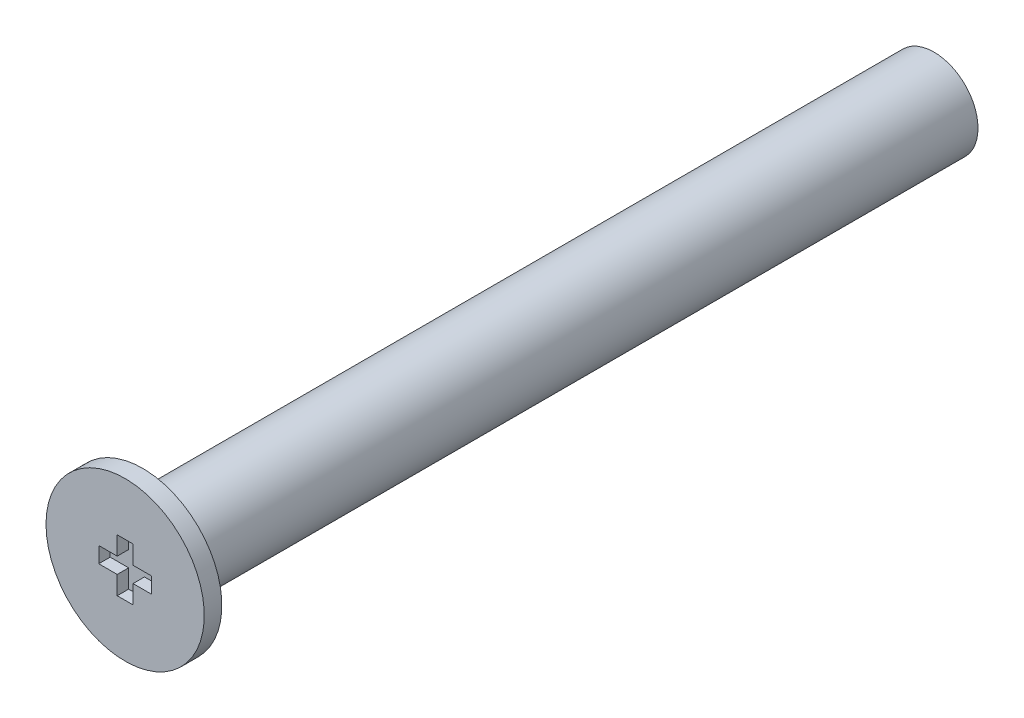
ISO-10303-21;
HEADER;
FILE_DESCRIPTION(('STEP AP214'),'2;1');
FILE_NAME('part.step','',(''),(''),'','','');
FILE_SCHEMA(('AUTOMOTIVE_DESIGN { 1 0 10303 214 1 1 1 1 }'));
ENDSEC;
DATA;
#1=APPLICATION_CONTEXT('core data for automotive mechanical design processes');
#2=APPLICATION_PROTOCOL_DEFINITION('international standard','automotive_design',2000,#1);
#3=PRODUCT_CONTEXT('',#1,'mechanical');
#4=PRODUCT('Part','Part','',(#3));
#5=PRODUCT_RELATED_PRODUCT_CATEGORY('part','',(#4));
#6=PRODUCT_DEFINITION_FORMATION('','',#4);
#7=PRODUCT_DEFINITION_CONTEXT('part definition',#1,'design');
#8=PRODUCT_DEFINITION('design','',#6,#7);
#9=PRODUCT_DEFINITION_SHAPE('','',#8);
#10=(LENGTH_UNIT() NAMED_UNIT(*) SI_UNIT(.MILLI.,.METRE.));
#11=(NAMED_UNIT(*) PLANE_ANGLE_UNIT() SI_UNIT($,.RADIAN.));
#12=(NAMED_UNIT(*) SI_UNIT($,.STERADIAN.) SOLID_ANGLE_UNIT());
#13=UNCERTAINTY_MEASURE_WITH_UNIT(LENGTH_MEASURE(1.E-05),#10,'distance_accuracy_value','');
#14=(GEOMETRIC_REPRESENTATION_CONTEXT(3) GLOBAL_UNCERTAINTY_ASSIGNED_CONTEXT((#13)) GLOBAL_UNIT_ASSIGNED_CONTEXT((#10,
#11,#12)) REPRESENTATION_CONTEXT('',''));
#15=CARTESIAN_POINT('',(0.,0.,0.));
#16=DIRECTION('',(0.,0.,1.));
#17=DIRECTION('',(1.,0.,0.));
#18=AXIS2_PLACEMENT_3D('',#15,#16,#17);
#19=CARTESIAN_POINT('',(0.,0.,-45.));
#20=DIRECTION('',(0.,0.,1.));
#21=DIRECTION('',(1.,0.,0.));
#22=AXIS2_PLACEMENT_3D('',#19,#20,#21);
#23=CYLINDRICAL_SURFACE('',#22,2.5);
#24=CARTESIAN_POINT('',(0.,0.,-45.));
#25=DIRECTION('',(0.,0.,1.));
#26=DIRECTION('',(1.,0.,0.));
#27=AXIS2_PLACEMENT_3D('',#24,#25,#26);
#28=CIRCLE('',#27,2.5);
#29=CARTESIAN_POINT('',(2.5,0.,-45.));
#30=VERTEX_POINT('',#29);
#31=EDGE_CURVE('E245',#30,#30,#28,.T.);
#32=CARTESIAN_POINT('',(0.,0.,0.));
#33=DIRECTION('',(0.,0.,1.));
#34=DIRECTION('',(1.,0.,0.));
#35=AXIS2_PLACEMENT_3D('',#32,#33,#34);
#36=CIRCLE('',#35,2.5);
#37=CARTESIAN_POINT('',(2.5,0.,0.));
#38=VERTEX_POINT('',#37);
#39=EDGE_CURVE('E241',#38,#38,#36,.T.);
#40=CARTESIAN_POINT('',(2.5,0.,-45.));
#41=CARTESIAN_POINT('',(2.5,0.,-44.53125));
#42=CARTESIAN_POINT('',(2.5,0.,-44.0625));
#43=CARTESIAN_POINT('',(2.5,0.,-43.125));
#44=CARTESIAN_POINT('',(2.5,0.,-42.65625));
#45=CARTESIAN_POINT('',(2.5,0.,-41.71875));
#46=CARTESIAN_POINT('',(2.5,0.,-41.25));
#47=CARTESIAN_POINT('',(2.5,0.,-40.3125));
#48=CARTESIAN_POINT('',(2.5,0.,-39.84375));
#49=CARTESIAN_POINT('',(2.5,0.,-38.90625));
#50=CARTESIAN_POINT('',(2.5,0.,-38.4375));
#51=CARTESIAN_POINT('',(2.5,0.,-37.5));
#52=CARTESIAN_POINT('',(2.5,0.,-37.03125));
#53=CARTESIAN_POINT('',(2.5,0.,-36.09375));
#54=CARTESIAN_POINT('',(2.5,0.,-35.625));
#55=CARTESIAN_POINT('',(2.5,0.,-34.6875));
#56=CARTESIAN_POINT('',(2.5,0.,-34.21875));
#57=CARTESIAN_POINT('',(2.5,0.,-33.28125));
#58=CARTESIAN_POINT('',(2.5,0.,-32.8125));
#59=CARTESIAN_POINT('',(2.5,0.,-31.875));
#60=CARTESIAN_POINT('',(2.5,0.,-31.40625));
#61=CARTESIAN_POINT('',(2.5,0.,-30.46875));
#62=CARTESIAN_POINT('',(2.5,0.,-30.));
#63=CARTESIAN_POINT('',(2.5,0.,-29.0625));
#64=CARTESIAN_POINT('',(2.5,0.,-28.59375));
#65=CARTESIAN_POINT('',(2.5,0.,-27.65625));
#66=CARTESIAN_POINT('',(2.5,0.,-27.1875));
#67=CARTESIAN_POINT('',(2.5,0.,-26.25));
#68=CARTESIAN_POINT('',(2.5,0.,-25.78125));
#69=CARTESIAN_POINT('',(2.5,0.,-24.84375));
#70=CARTESIAN_POINT('',(2.5,0.,-24.375));
#71=CARTESIAN_POINT('',(2.5,0.,-23.4375));
#72=CARTESIAN_POINT('',(2.5,0.,-22.96875));
#73=CARTESIAN_POINT('',(2.5,0.,-22.03125));
#74=CARTESIAN_POINT('',(2.5,0.,-21.5625));
#75=CARTESIAN_POINT('',(2.5,0.,-20.625));
#76=CARTESIAN_POINT('',(2.5,0.,-20.15625));
#77=CARTESIAN_POINT('',(2.5,0.,-19.21875));
#78=CARTESIAN_POINT('',(2.5,0.,-18.75));
#79=CARTESIAN_POINT('',(2.5,0.,-17.8125));
#80=CARTESIAN_POINT('',(2.5,0.,-17.34375));
#81=CARTESIAN_POINT('',(2.5,0.,-16.40625));
#82=CARTESIAN_POINT('',(2.5,0.,-15.9375));
#83=CARTESIAN_POINT('',(2.5,0.,-15.));
#84=CARTESIAN_POINT('',(2.5,0.,-14.53125));
#85=CARTESIAN_POINT('',(2.5,0.,-13.59375));
#86=CARTESIAN_POINT('',(2.5,0.,-13.125));
#87=CARTESIAN_POINT('',(2.5,0.,-12.1875));
#88=CARTESIAN_POINT('',(2.5,0.,-11.71875));
#89=CARTESIAN_POINT('',(2.5,0.,-10.78125));
#90=CARTESIAN_POINT('',(2.5,0.,-10.3125));
#91=CARTESIAN_POINT('',(2.5,0.,-9.37500000000001));
#92=CARTESIAN_POINT('',(2.5,0.,-8.90625000000001));
#93=CARTESIAN_POINT('',(2.5,0.,-7.96875000000001));
#94=CARTESIAN_POINT('',(2.5,0.,-7.50000000000001));
#95=CARTESIAN_POINT('',(2.5,0.,-6.56250000000001));
#96=CARTESIAN_POINT('',(2.5,0.,-6.09375000000001));
#97=CARTESIAN_POINT('',(2.5,0.,-5.15625000000001));
#98=CARTESIAN_POINT('',(2.5,0.,-4.68750000000001));
#99=CARTESIAN_POINT('',(2.5,0.,-3.75000000000001));
#100=CARTESIAN_POINT('',(2.5,0.,-3.28125000000001));
#101=CARTESIAN_POINT('',(2.5,0.,-2.34375000000001));
#102=CARTESIAN_POINT('',(2.5,0.,-1.87500000000001));
#103=CARTESIAN_POINT('',(2.5,0.,-0.937500000000006));
#104=CARTESIAN_POINT('',(2.5,0.,-0.468750000000007));
#105=CARTESIAN_POINT('',(2.5,0.,0.));
#106=B_SPLINE_CURVE_WITH_KNOTS('',3,(#40,#41,#42,#43,#44,#45,#46,#47,#48,#49,#50,#51,#52,#53,
#54,#55,#56,#57,#58,#59,#60,#61,#62,#63,#64,#65,#66,#67,#68,#69,#70,#71,#72,#73,#74,#75,#76,#77,
#78,#79,#80,#81,#82,#83,#84,#85,#86,#87,#88,#89,#90,#91,#92,#93,#94,#95,#96,#97,#98,#99,#100,
#101,#102,#103,#104,#105),.UNSPECIFIED.,.F.,.F.,(4,2,2,2,2,2,2,2,2,2,2,2,2,2,2,2,2,2,2,2,2,2,2,
2,2,2,2,2,2,2,2,2,4),(0.,1.40625,2.8125,4.21875,5.62500000000001,7.03125,8.4375,
9.84375000000001,11.25,12.65625,14.0625,15.46875,16.875,18.28125,19.6875,21.09375,22.5,23.90625,
25.3125,26.71875,28.125,29.53125,30.9375,32.34375,33.75,35.15625,36.5625,37.96875,39.375,
40.78125,42.1875,43.59375,45.),.UNSPECIFIED.);
#107=EDGE_CURVE('BSEAM44',#30,#38,#106,.T.);
#108=ORIENTED_EDGE('',*,*,#31,.T.);
#109=ORIENTED_EDGE('',*,*,#39,.F.);
#110=ORIENTED_EDGE('',*,*,#107,.T.);
#111=ORIENTED_EDGE('',*,*,#107,.F.);
#112=EDGE_LOOP('',(#108,#110,#109,#111));
#113=FACE_BOUND('',#112,.T.);
#114=ADVANCED_FACE('F44',(#113),#23,.T.);
#115=CARTESIAN_POINT('',(0.,0.,-45.));
#116=DIRECTION('',(0.,0.,1.));
#117=DIRECTION('',(1.,0.,0.));
#118=AXIS2_PLACEMENT_3D('',#115,#116,#117);
#119=PLANE('',#118);
#120=ORIENTED_EDGE('',*,*,#31,.F.);
#121=EDGE_LOOP('',(#120));
#122=FACE_BOUND('',#121,.T.);
#123=ADVANCED_FACE('F329',(#122),#119,.F.);
#124=CARTESIAN_POINT('',(0.,0.,0.));
#125=DIRECTION('',(0.,0.,1.));
#126=DIRECTION('',(1.,0.,0.));
#127=AXIS2_PLACEMENT_3D('',#124,#125,#126);
#128=PLANE('',#127);
#129=ORIENTED_EDGE('',*,*,#39,.T.);
#130=EDGE_LOOP('',(#129));
#131=FACE_BOUND('',#130,.T.);
#132=CARTESIAN_POINT('',(0.,0.,0.));
#133=DIRECTION('',(0.,0.,-1.));
#134=DIRECTION('',(-1.,0.,0.));
#135=AXIS2_PLACEMENT_3D('',#132,#133,#134);
#136=CIRCLE('',#135,4.5);
#137=CARTESIAN_POINT('',(-4.5,0.,0.));
#138=VERTEX_POINT('',#137);
#139=EDGE_CURVE('E240',#138,#138,#136,.T.);
#140=ORIENTED_EDGE('',*,*,#139,.T.);
#141=EDGE_LOOP('',(#140));
#142=FACE_BOUND('',#141,.T.);
#143=ADVANCED_FACE('F331',(#131,#142),#128,.F.);
#144=CARTESIAN_POINT('',(0.,0.,-2.));
#145=DIRECTION('',(0.,0.,-1.));
#146=DIRECTION('',(-1.,0.,0.));
#147=AXIS2_PLACEMENT_3D('',#144,#145,#146);
#148=CYLINDRICAL_SURFACE('',#147,4.5);
#149=ORIENTED_EDGE('',*,*,#139,.F.);
#150=EDGE_LOOP('',(#149));
#151=FACE_BOUND('',#150,.T.);
#152=CARTESIAN_POINT('',(0.,0.,1.));
#153=DIRECTION('',(0.,0.,-1.));
#154=DIRECTION('',(-1.,0.,0.));
#155=AXIS2_PLACEMENT_3D('',#152,#153,#154);
#156=CIRCLE('',#155,4.5);
#157=CARTESIAN_POINT('',(-4.5,0.,1.));
#158=VERTEX_POINT('',#157);
#159=EDGE_CURVE('E196',#158,#158,#156,.T.);
#160=ORIENTED_EDGE('',*,*,#159,.T.);
#161=EDGE_LOOP('',(#160));
#162=FACE_BOUND('',#161,.T.);
#163=ADVANCED_FACE('F341',(#151,#162),#148,.T.);
#164=CARTESIAN_POINT('',(4.5,0.,1.));
#165=DIRECTION('',(0.,0.,-1.));
#166=DIRECTION('',(-1.,0.,0.));
#167=AXIS2_PLACEMENT_3D('',#164,#165,#166);
#168=PLANE('',#167);
#169=DIRECTION('',(-1.,0.,0.));
#170=VECTOR('',#169,1.);
#171=CARTESIAN_POINT('',(4.5,-1.5,1.));
#172=LINE('',#171,#170);
#173=CARTESIAN_POINT('',(0.45,-1.5,1.));
#174=VERTEX_POINT('',#173);
#175=CARTESIAN_POINT('',(-0.45,-1.5,1.));
#176=VERTEX_POINT('',#175);
#177=EDGE_CURVE('E246',#174,#176,#172,.T.);
#178=ORIENTED_EDGE('',*,*,#177,.T.);
#179=DIRECTION('',(0.,1.,0.));
#180=VECTOR('',#179,1.);
#181=CARTESIAN_POINT('',(-0.45,0.,1.));
#182=LINE('',#181,#180);
#183=CARTESIAN_POINT('',(-0.45,-0.45,1.));
#184=VERTEX_POINT('',#183);
#185=EDGE_CURVE('E11',#176,#184,#182,.T.);
#186=ORIENTED_EDGE('',*,*,#185,.T.);
#187=DIRECTION('',(-1.,0.,0.));
#188=VECTOR('',#187,1.);
#189=CARTESIAN_POINT('',(4.5,-0.45,1.));
#190=LINE('',#189,#188);
#191=CARTESIAN_POINT('',(-1.5,-0.45,1.));
#192=VERTEX_POINT('',#191);
#193=EDGE_CURVE('E52',#184,#192,#190,.T.);
#194=ORIENTED_EDGE('',*,*,#193,.T.);
#195=DIRECTION('',(0.,1.,0.));
#196=VECTOR('',#195,1.);
#197=CARTESIAN_POINT('',(-1.5,0.,1.));
#198=LINE('',#197,#196);
#199=CARTESIAN_POINT('',(-1.5,0.45,1.));
#200=VERTEX_POINT('',#199);
#201=EDGE_CURVE('E281',#192,#200,#198,.T.);
#202=ORIENTED_EDGE('',*,*,#201,.T.);
#203=DIRECTION('',(1.,0.,0.));
#204=VECTOR('',#203,1.);
#205=CARTESIAN_POINT('',(4.5,0.45,1.));
#206=LINE('',#205,#204);
#207=CARTESIAN_POINT('',(-0.45,0.45,1.));
#208=VERTEX_POINT('',#207);
#209=EDGE_CURVE('E279',#200,#208,#206,.T.);
#210=ORIENTED_EDGE('',*,*,#209,.T.);
#211=DIRECTION('',(0.,1.,0.));
#212=VECTOR('',#211,1.);
#213=CARTESIAN_POINT('',(-0.45,0.,1.));
#214=LINE('',#213,#212);
#215=CARTESIAN_POINT('',(-0.45,1.5,1.));
#216=VERTEX_POINT('',#215);
#217=EDGE_CURVE('E276',#208,#216,#214,.T.);
#218=ORIENTED_EDGE('',*,*,#217,.T.);
#219=DIRECTION('',(1.,0.,0.));
#220=VECTOR('',#219,1.);
#221=CARTESIAN_POINT('',(4.5,1.5,1.));
#222=LINE('',#221,#220);
#223=CARTESIAN_POINT('',(0.45,1.5,1.));
#224=VERTEX_POINT('',#223);
#225=EDGE_CURVE('E275',#216,#224,#222,.T.);
#226=ORIENTED_EDGE('',*,*,#225,.T.);
#227=DIRECTION('',(0.,-1.,0.));
#228=VECTOR('',#227,1.);
#229=CARTESIAN_POINT('',(0.45,0.,1.));
#230=LINE('',#229,#228);
#231=CARTESIAN_POINT('',(0.45,0.45,1.));
#232=VERTEX_POINT('',#231);
#233=EDGE_CURVE('E268',#224,#232,#230,.T.);
#234=ORIENTED_EDGE('',*,*,#233,.T.);
#235=DIRECTION('',(1.,0.,0.));
#236=VECTOR('',#235,1.);
#237=CARTESIAN_POINT('',(4.5,0.45,1.));
#238=LINE('',#237,#236);
#239=CARTESIAN_POINT('',(1.5,0.45,1.));
#240=VERTEX_POINT('',#239);
#241=EDGE_CURVE('E264',#232,#240,#238,.T.);
#242=ORIENTED_EDGE('',*,*,#241,.T.);
#243=DIRECTION('',(0.,-1.,0.));
#244=VECTOR('',#243,1.);
#245=CARTESIAN_POINT('',(1.5,0.,1.));
#246=LINE('',#245,#244);
#247=CARTESIAN_POINT('',(1.5,-0.45,1.));
#248=VERTEX_POINT('',#247);
#249=EDGE_CURVE('E259',#240,#248,#246,.T.);
#250=ORIENTED_EDGE('',*,*,#249,.T.);
#251=DIRECTION('',(-1.,0.,0.));
#252=VECTOR('',#251,1.);
#253=CARTESIAN_POINT('',(4.5,-0.45,1.));
#254=LINE('',#253,#252);
#255=CARTESIAN_POINT('',(0.45,-0.45,1.));
#256=VERTEX_POINT('',#255);
#257=EDGE_CURVE('E258',#248,#256,#254,.T.);
#258=ORIENTED_EDGE('',*,*,#257,.T.);
#259=DIRECTION('',(0.,-1.,0.));
#260=VECTOR('',#259,1.);
#261=CARTESIAN_POINT('',(0.45,0.,1.));
#262=LINE('',#261,#260);
#263=EDGE_CURVE('E252',#256,#174,#262,.T.);
#264=ORIENTED_EDGE('',*,*,#263,.T.);
#265=EDGE_LOOP('',(#178,#186,#194,#202,#210,#218,#226,#234,#242,#250,#258,#264));
#266=FACE_BOUND('',#265,.T.);
#267=ORIENTED_EDGE('',*,*,#159,.F.);
#268=EDGE_LOOP('',(#267));
#269=FACE_BOUND('',#268,.T.);
#270=ADVANCED_FACE('F286',(#266,#269),#168,.F.);
#271=CARTESIAN_POINT('',(-0.45,-0.45,0.35));
#272=DIRECTION('',(-1.,0.,0.));
#273=DIRECTION('',(0.,0.,1.));
#274=AXIS2_PLACEMENT_3D('',#271,#272,#273);
#275=PLANE('',#274);
#276=DIRECTION('',(0.,0.,1.));
#277=VECTOR('',#276,1.);
#278=CARTESIAN_POINT('',(-0.45,-1.5,0.35));
#279=LINE('',#278,#277);
#280=CARTESIAN_POINT('',(-0.45,-1.5,0.35));
#281=VERTEX_POINT('',#280);
#282=EDGE_CURVE('E58',#281,#176,#279,.T.);
#283=ORIENTED_EDGE('',*,*,#282,.F.);
#284=DIRECTION('',(0.,-1.,0.));
#285=VECTOR('',#284,1.);
#286=CARTESIAN_POINT('',(-0.45,-0.45,0.35));
#287=LINE('',#286,#285);
#288=CARTESIAN_POINT('',(-0.45,-0.45,0.35));
#289=VERTEX_POINT('',#288);
#290=EDGE_CURVE('E133',#289,#281,#287,.T.);
#291=ORIENTED_EDGE('',*,*,#290,.F.);
#292=DIRECTION('',(0.,0.,1.));
#293=VECTOR('',#292,1.);
#294=CARTESIAN_POINT('',(-0.45,-0.45,0.35));
#295=LINE('',#294,#293);
#296=EDGE_CURVE('E193',#289,#184,#295,.T.);
#297=ORIENTED_EDGE('',*,*,#296,.T.);
#298=ORIENTED_EDGE('',*,*,#185,.F.);
#299=EDGE_LOOP('',(#283,#291,#297,#298));
#300=FACE_BOUND('',#299,.T.);
#301=ADVANCED_FACE('F134',(#300),#275,.F.);
#302=CARTESIAN_POINT('',(-1.5,-0.45,0.35));
#303=DIRECTION('',(0.,-1.,0.));
#304=DIRECTION('',(0.,0.,-1.));
#305=AXIS2_PLACEMENT_3D('',#302,#303,#304);
#306=PLANE('',#305);
#307=ORIENTED_EDGE('',*,*,#296,.F.);
#308=DIRECTION('',(1.,0.,0.));
#309=VECTOR('',#308,1.);
#310=CARTESIAN_POINT('',(-1.5,-0.45,0.35));
#311=LINE('',#310,#309);
#312=CARTESIAN_POINT('',(-1.5,-0.45,0.35));
#313=VERTEX_POINT('',#312);
#314=EDGE_CURVE('E138',#313,#289,#311,.T.);
#315=ORIENTED_EDGE('',*,*,#314,.F.);
#316=DIRECTION('',(0.,0.,1.));
#317=VECTOR('',#316,1.);
#318=CARTESIAN_POINT('',(-1.5,-0.45,0.35));
#319=LINE('',#318,#317);
#320=EDGE_CURVE('E200',#313,#192,#319,.T.);
#321=ORIENTED_EDGE('',*,*,#320,.T.);
#322=ORIENTED_EDGE('',*,*,#193,.F.);
#323=EDGE_LOOP('',(#307,#315,#321,#322));
#324=FACE_BOUND('',#323,.T.);
#325=ADVANCED_FACE('F320',(#324),#306,.F.);
#326=CARTESIAN_POINT('',(-1.5,0.45,0.35));
#327=DIRECTION('',(-1.,0.,0.));
#328=DIRECTION('',(0.,0.,1.));
#329=AXIS2_PLACEMENT_3D('',#326,#327,#328);
#330=PLANE('',#329);
#331=ORIENTED_EDGE('',*,*,#320,.F.);
#332=DIRECTION('',(0.,-1.,0.));
#333=VECTOR('',#332,1.);
#334=CARTESIAN_POINT('',(-1.5,0.45,0.35));
#335=LINE('',#334,#333);
#336=CARTESIAN_POINT('',(-1.5,0.45,0.35));
#337=VERTEX_POINT('',#336);
#338=EDGE_CURVE('E186',#337,#313,#335,.T.);
#339=ORIENTED_EDGE('',*,*,#338,.F.);
#340=DIRECTION('',(0.,0.,1.));
#341=VECTOR('',#340,1.);
#342=CARTESIAN_POINT('',(-1.5,0.45,0.35));
#343=LINE('',#342,#341);
#344=EDGE_CURVE('E199',#337,#200,#343,.T.);
#345=ORIENTED_EDGE('',*,*,#344,.T.);
#346=ORIENTED_EDGE('',*,*,#201,.F.);
#347=EDGE_LOOP('',(#331,#339,#345,#346));
#348=FACE_BOUND('',#347,.T.);
#349=ADVANCED_FACE('F316',(#348),#330,.F.);
#350=CARTESIAN_POINT('',(-0.45,0.45,0.35));
#351=DIRECTION('',(0.,1.,0.));
#352=DIRECTION('',(0.,0.,1.));
#353=AXIS2_PLACEMENT_3D('',#350,#351,#352);
#354=PLANE('',#353);
#355=ORIENTED_EDGE('',*,*,#344,.F.);
#356=DIRECTION('',(-1.,0.,0.));
#357=VECTOR('',#356,1.);
#358=CARTESIAN_POINT('',(-0.45,0.45,0.35));
#359=LINE('',#358,#357);
#360=CARTESIAN_POINT('',(-0.45,0.45,0.35));
#361=VERTEX_POINT('',#360);
#362=EDGE_CURVE('E185',#361,#337,#359,.T.);
#363=ORIENTED_EDGE('',*,*,#362,.F.);
#364=DIRECTION('',(0.,0.,1.));
#365=VECTOR('',#364,1.);
#366=CARTESIAN_POINT('',(-0.45,0.45,0.35));
#367=LINE('',#366,#365);
#368=EDGE_CURVE('E203',#361,#208,#367,.T.);
#369=ORIENTED_EDGE('',*,*,#368,.T.);
#370=ORIENTED_EDGE('',*,*,#209,.F.);
#371=EDGE_LOOP('',(#355,#363,#369,#370));
#372=FACE_BOUND('',#371,.T.);
#373=ADVANCED_FACE('F311',(#372),#354,.F.);
#374=CARTESIAN_POINT('',(-0.45,1.5,0.35));
#375=DIRECTION('',(-1.,0.,0.));
#376=DIRECTION('',(0.,0.,1.));
#377=AXIS2_PLACEMENT_3D('',#374,#375,#376);
#378=PLANE('',#377);
#379=ORIENTED_EDGE('',*,*,#368,.F.);
#380=DIRECTION('',(0.,-1.,0.));
#381=VECTOR('',#380,1.);
#382=CARTESIAN_POINT('',(-0.45,1.5,0.35));
#383=LINE('',#382,#381);
#384=CARTESIAN_POINT('',(-0.45,1.5,0.35));
#385=VERTEX_POINT('',#384);
#386=EDGE_CURVE('E180',#385,#361,#383,.T.);
#387=ORIENTED_EDGE('',*,*,#386,.F.);
#388=DIRECTION('',(0.,0.,1.));
#389=VECTOR('',#388,1.);
#390=CARTESIAN_POINT('',(-0.45,1.5,0.35));
#391=LINE('',#390,#389);
#392=EDGE_CURVE('E209',#385,#216,#391,.T.);
#393=ORIENTED_EDGE('',*,*,#392,.T.);
#394=ORIENTED_EDGE('',*,*,#217,.F.);
#395=EDGE_LOOP('',(#379,#387,#393,#394));
#396=FACE_BOUND('',#395,.T.);
#397=ADVANCED_FACE('F308',(#396),#378,.F.);
#398=CARTESIAN_POINT('',(0.45,1.5,0.35));
#399=DIRECTION('',(0.,1.,0.));
#400=DIRECTION('',(0.,0.,1.));
#401=AXIS2_PLACEMENT_3D('',#398,#399,#400);
#402=PLANE('',#401);
#403=ORIENTED_EDGE('',*,*,#392,.F.);
#404=DIRECTION('',(-1.,0.,0.));
#405=VECTOR('',#404,1.);
#406=CARTESIAN_POINT('',(0.45,1.5,0.35));
#407=LINE('',#406,#405);
#408=CARTESIAN_POINT('',(0.45,1.5,0.35));
#409=VERTEX_POINT('',#408);
#410=EDGE_CURVE('E176',#409,#385,#407,.T.);
#411=ORIENTED_EDGE('',*,*,#410,.F.);
#412=DIRECTION('',(0.,0.,1.));
#413=VECTOR('',#412,1.);
#414=CARTESIAN_POINT('',(0.45,1.5,0.35));
#415=LINE('',#414,#413);
#416=EDGE_CURVE('E215',#409,#224,#415,.T.);
#417=ORIENTED_EDGE('',*,*,#416,.T.);
#418=ORIENTED_EDGE('',*,*,#225,.F.);
#419=EDGE_LOOP('',(#403,#411,#417,#418));
#420=FACE_BOUND('',#419,.T.);
#421=ADVANCED_FACE('F310',(#420),#402,.F.);
#422=CARTESIAN_POINT('',(0.45,0.45,0.35));
#423=DIRECTION('',(1.,0.,0.));
#424=DIRECTION('',(0.,0.,-1.));
#425=AXIS2_PLACEMENT_3D('',#422,#423,#424);
#426=PLANE('',#425);
#427=ORIENTED_EDGE('',*,*,#416,.F.);
#428=DIRECTION('',(0.,1.,0.));
#429=VECTOR('',#428,1.);
#430=CARTESIAN_POINT('',(0.45,0.45,0.35));
#431=LINE('',#430,#429);
#432=CARTESIAN_POINT('',(0.45,0.45,0.35));
#433=VERTEX_POINT('',#432);
#434=EDGE_CURVE('E175',#433,#409,#431,.T.);
#435=ORIENTED_EDGE('',*,*,#434,.F.);
#436=DIRECTION('',(0.,0.,1.));
#437=VECTOR('',#436,1.);
#438=CARTESIAN_POINT('',(0.45,0.45,0.35));
#439=LINE('',#438,#437);
#440=EDGE_CURVE('E216',#433,#232,#439,.T.);
#441=ORIENTED_EDGE('',*,*,#440,.T.);
#442=ORIENTED_EDGE('',*,*,#233,.F.);
#443=EDGE_LOOP('',(#427,#435,#441,#442));
#444=FACE_BOUND('',#443,.T.);
#445=ADVANCED_FACE('F305',(#444),#426,.F.);
#446=CARTESIAN_POINT('',(1.5,0.45,0.35));
#447=DIRECTION('',(0.,1.,0.));
#448=DIRECTION('',(0.,0.,1.));
#449=AXIS2_PLACEMENT_3D('',#446,#447,#448);
#450=PLANE('',#449);
#451=ORIENTED_EDGE('',*,*,#440,.F.);
#452=DIRECTION('',(-1.,0.,0.));
#453=VECTOR('',#452,1.);
#454=CARTESIAN_POINT('',(1.5,0.45,0.35));
#455=LINE('',#454,#453);
#456=CARTESIAN_POINT('',(1.5,0.45,0.35));
#457=VERTEX_POINT('',#456);
#458=EDGE_CURVE('E167',#457,#433,#455,.T.);
#459=ORIENTED_EDGE('',*,*,#458,.F.);
#460=DIRECTION('',(0.,0.,1.));
#461=VECTOR('',#460,1.);
#462=CARTESIAN_POINT('',(1.5,0.45,0.35));
#463=LINE('',#462,#461);
#464=EDGE_CURVE('E219',#457,#240,#463,.T.);
#465=ORIENTED_EDGE('',*,*,#464,.T.);
#466=ORIENTED_EDGE('',*,*,#241,.F.);
#467=EDGE_LOOP('',(#451,#459,#465,#466));
#468=FACE_BOUND('',#467,.T.);
#469=ADVANCED_FACE('F301',(#468),#450,.F.);
#470=CARTESIAN_POINT('',(1.5,-0.45,0.35));
#471=DIRECTION('',(1.,0.,0.));
#472=DIRECTION('',(0.,0.,-1.));
#473=AXIS2_PLACEMENT_3D('',#470,#471,#472);
#474=PLANE('',#473);
#475=ORIENTED_EDGE('',*,*,#464,.F.);
#476=DIRECTION('',(0.,1.,0.));
#477=VECTOR('',#476,1.);
#478=CARTESIAN_POINT('',(1.5,-0.45,0.35));
#479=LINE('',#478,#477);
#480=CARTESIAN_POINT('',(1.5,-0.45,0.35));
#481=VERTEX_POINT('',#480);
#482=EDGE_CURVE('E161',#481,#457,#479,.T.);
#483=ORIENTED_EDGE('',*,*,#482,.F.);
#484=DIRECTION('',(0.,0.,1.));
#485=VECTOR('',#484,1.);
#486=CARTESIAN_POINT('',(1.5,-0.45,0.35));
#487=LINE('',#486,#485);
#488=EDGE_CURVE('E222',#481,#248,#487,.T.);
#489=ORIENTED_EDGE('',*,*,#488,.T.);
#490=ORIENTED_EDGE('',*,*,#249,.F.);
#491=EDGE_LOOP('',(#475,#483,#489,#490));
#492=FACE_BOUND('',#491,.T.);
#493=ADVANCED_FACE('F298',(#492),#474,.F.);
#494=CARTESIAN_POINT('',(0.45,-0.45,0.35));
#495=DIRECTION('',(0.,-1.,0.));
#496=DIRECTION('',(0.,0.,-1.));
#497=AXIS2_PLACEMENT_3D('',#494,#495,#496);
#498=PLANE('',#497);
#499=ORIENTED_EDGE('',*,*,#488,.F.);
#500=DIRECTION('',(1.,0.,0.));
#501=VECTOR('',#500,1.);
#502=CARTESIAN_POINT('',(0.45,-0.45,0.35));
#503=LINE('',#502,#501);
#504=CARTESIAN_POINT('',(0.45,-0.45,0.35));
#505=VERTEX_POINT('',#504);
#506=EDGE_CURVE('E158',#505,#481,#503,.T.);
#507=ORIENTED_EDGE('',*,*,#506,.F.);
#508=DIRECTION('',(0.,0.,1.));
#509=VECTOR('',#508,1.);
#510=CARTESIAN_POINT('',(0.45,-0.45,0.35));
#511=LINE('',#510,#509);
#512=EDGE_CURVE('E229',#505,#256,#511,.T.);
#513=ORIENTED_EDGE('',*,*,#512,.T.);
#514=ORIENTED_EDGE('',*,*,#257,.F.);
#515=EDGE_LOOP('',(#499,#507,#513,#514));
#516=FACE_BOUND('',#515,.T.);
#517=ADVANCED_FACE('F296',(#516),#498,.F.);
#518=CARTESIAN_POINT('',(0.45,-1.5,0.35));
#519=DIRECTION('',(1.,0.,0.));
#520=DIRECTION('',(0.,0.,-1.));
#521=AXIS2_PLACEMENT_3D('',#518,#519,#520);
#522=PLANE('',#521);
#523=ORIENTED_EDGE('',*,*,#512,.F.);
#524=DIRECTION('',(0.,1.,0.));
#525=VECTOR('',#524,1.);
#526=CARTESIAN_POINT('',(0.45,-1.5,0.35));
#527=LINE('',#526,#525);
#528=CARTESIAN_POINT('',(0.45,-1.5,0.35));
#529=VERTEX_POINT('',#528);
#530=EDGE_CURVE('E149',#529,#505,#527,.T.);
#531=ORIENTED_EDGE('',*,*,#530,.F.);
#532=DIRECTION('',(0.,0.,1.));
#533=VECTOR('',#532,1.);
#534=CARTESIAN_POINT('',(0.45,-1.5,0.35));
#535=LINE('',#534,#533);
#536=EDGE_CURVE('E136',#529,#174,#535,.T.);
#537=ORIENTED_EDGE('',*,*,#536,.T.);
#538=ORIENTED_EDGE('',*,*,#263,.F.);
#539=EDGE_LOOP('',(#523,#531,#537,#538));
#540=FACE_BOUND('',#539,.T.);
#541=ADVANCED_FACE('F295',(#540),#522,.F.);
#542=CARTESIAN_POINT('',(-0.45,-1.5,0.35));
#543=DIRECTION('',(0.,-1.,0.));
#544=DIRECTION('',(0.,0.,-1.));
#545=AXIS2_PLACEMENT_3D('',#542,#543,#544);
#546=PLANE('',#545);
#547=ORIENTED_EDGE('',*,*,#536,.F.);
#548=DIRECTION('',(1.,0.,0.));
#549=VECTOR('',#548,1.);
#550=CARTESIAN_POINT('',(-0.45,-1.5,0.35));
#551=LINE('',#550,#549);
#552=EDGE_CURVE('E142',#281,#529,#551,.T.);
#553=ORIENTED_EDGE('',*,*,#552,.F.);
#554=ORIENTED_EDGE('',*,*,#282,.T.);
#555=ORIENTED_EDGE('',*,*,#177,.F.);
#556=EDGE_LOOP('',(#547,#553,#554,#555));
#557=FACE_BOUND('',#556,.T.);
#558=ADVANCED_FACE('F143',(#557),#546,.F.);
#559=CARTESIAN_POINT('',(0.,0.,0.35));
#560=DIRECTION('',(0.,0.,1.));
#561=DIRECTION('',(1.,0.,0.));
#562=AXIS2_PLACEMENT_3D('',#559,#560,#561);
#563=PLANE('',#562);
#564=ORIENTED_EDGE('',*,*,#290,.T.);
#565=ORIENTED_EDGE('',*,*,#552,.T.);
#566=ORIENTED_EDGE('',*,*,#530,.T.);
#567=ORIENTED_EDGE('',*,*,#506,.T.);
#568=ORIENTED_EDGE('',*,*,#482,.T.);
#569=ORIENTED_EDGE('',*,*,#458,.T.);
#570=ORIENTED_EDGE('',*,*,#434,.T.);
#571=ORIENTED_EDGE('',*,*,#410,.T.);
#572=ORIENTED_EDGE('',*,*,#386,.T.);
#573=ORIENTED_EDGE('',*,*,#362,.T.);
#574=ORIENTED_EDGE('',*,*,#338,.T.);
#575=ORIENTED_EDGE('',*,*,#314,.T.);
#576=EDGE_LOOP('',(#564,#565,#566,#567,#568,#569,#570,#571,#572,#573,#574,#575));
#577=FACE_BOUND('',#576,.T.);
#578=ADVANCED_FACE('F152',(#577),#563,.T.);
#579=CLOSED_SHELL('',(#114,#123,#143,#163,#270,#301,#325,#349,#373,#397,#421,#445,#469,#493,
#517,#541,#558,#578));
#580=MANIFOLD_SOLID_BREP('B2',#579);
#581=ADVANCED_BREP_SHAPE_REPRESENTATION('',(#18,#580),#14);
#582=SHAPE_DEFINITION_REPRESENTATION(#9,#581);
ENDSEC;
END-ISO-10303-21;
